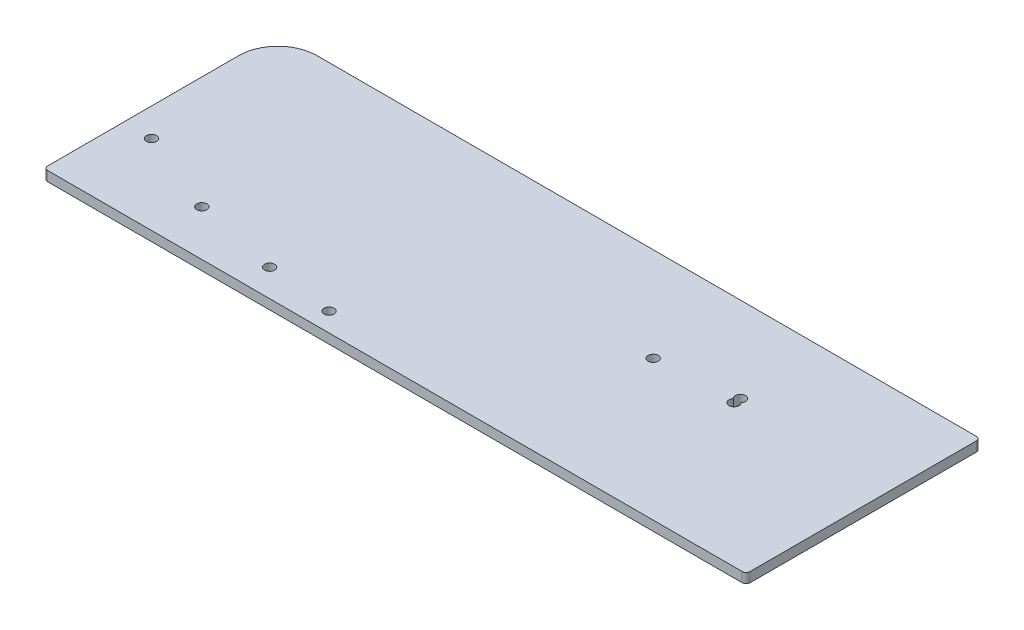
ISO-10303-21;
HEADER;
FILE_DESCRIPTION(('STEP AP214'),'2;1');
FILE_NAME('part.step','',(''),(''),'','','');
FILE_SCHEMA(('AUTOMOTIVE_DESIGN { 1 0 10303 214 1 1 1 1 }'));
ENDSEC;
DATA;
#1=APPLICATION_CONTEXT('core data for automotive mechanical design processes');
#2=APPLICATION_PROTOCOL_DEFINITION('international standard','automotive_design',2000,#1);
#3=PRODUCT_CONTEXT('',#1,'mechanical');
#4=PRODUCT('Part','Part','',(#3));
#5=PRODUCT_RELATED_PRODUCT_CATEGORY('part','',(#4));
#6=PRODUCT_DEFINITION_FORMATION('','',#4);
#7=PRODUCT_DEFINITION_CONTEXT('part definition',#1,'design');
#8=PRODUCT_DEFINITION('design','',#6,#7);
#9=PRODUCT_DEFINITION_SHAPE('','',#8);
#10=(LENGTH_UNIT() NAMED_UNIT(*) SI_UNIT(.MILLI.,.METRE.));
#11=(NAMED_UNIT(*) PLANE_ANGLE_UNIT() SI_UNIT($,.RADIAN.));
#12=(NAMED_UNIT(*) SI_UNIT($,.STERADIAN.) SOLID_ANGLE_UNIT());
#13=UNCERTAINTY_MEASURE_WITH_UNIT(LENGTH_MEASURE(1.E-05),#10,'distance_accuracy_value','');
#14=(GEOMETRIC_REPRESENTATION_CONTEXT(3) GLOBAL_UNCERTAINTY_ASSIGNED_CONTEXT((#13)) GLOBAL_UNIT_ASSIGNED_CONTEXT((#10,
#11,#12)) REPRESENTATION_CONTEXT('',''));
#15=CARTESIAN_POINT('',(0.,0.,0.));
#16=DIRECTION('',(0.,0.,1.));
#17=DIRECTION('',(1.,0.,0.));
#18=AXIS2_PLACEMENT_3D('',#15,#16,#17);
#19=CARTESIAN_POINT('',(13.97,666.75,-25.4));
#20=DIRECTION('',(1.,0.,0.));
#21=DIRECTION('',(0.,0.,-1.));
#22=AXIS2_PLACEMENT_3D('',#19,#20,#21);
#23=PLANE('',#22);
#24=DIRECTION('',(0.,0.,1.));
#25=VECTOR('',#24,1.);
#26=CARTESIAN_POINT('',(13.97,660.4,-25.4));
#27=LINE('',#26,#25);
#28=CARTESIAN_POINT('',(13.97,660.4,-152.4));
#29=VERTEX_POINT('',#28);
#30=CARTESIAN_POINT('',(13.97,660.4,-27.94));
#31=VERTEX_POINT('',#30);
#32=EDGE_CURVE('E167',#29,#31,#27,.T.);
#33=ORIENTED_EDGE('',*,*,#32,.T.);
#34=DIRECTION('',(0.,-1.,0.));
#35=VECTOR('',#34,1.);
#36=CARTESIAN_POINT('',(13.97,666.75,-27.94));
#37=LINE('',#36,#35);
#38=CARTESIAN_POINT('',(13.97,666.75,-27.94));
#39=VERTEX_POINT('',#38);
#40=EDGE_CURVE('E11',#31,#39,#37,.F.);
#41=ORIENTED_EDGE('',*,*,#40,.T.);
#42=DIRECTION('',(0.,0.,1.));
#43=VECTOR('',#42,1.);
#44=CARTESIAN_POINT('',(13.97,666.75,-25.4));
#45=LINE('',#44,#43);
#46=CARTESIAN_POINT('',(13.97,666.75,-152.4));
#47=VERTEX_POINT('',#46);
#48=EDGE_CURVE('E156',#47,#39,#45,.T.);
#49=ORIENTED_EDGE('',*,*,#48,.F.);
#50=DIRECTION('',(0.,-1.,0.));
#51=VECTOR('',#50,1.);
#52=CARTESIAN_POINT('',(13.97,666.75,-152.4));
#53=LINE('',#52,#51);
#54=EDGE_CURVE('E166',#47,#29,#53,.T.);
#55=ORIENTED_EDGE('',*,*,#54,.T.);
#56=EDGE_LOOP('',(#33,#41,#49,#55));
#57=FACE_BOUND('',#56,.T.);
#58=ADVANCED_FACE('F41',(#57),#23,.F.);
#59=CARTESIAN_POINT('',(13.97,666.75,-25.4));
#60=DIRECTION('',(0.,0.,-1.));
#61=DIRECTION('',(-1.,0.,0.));
#62=AXIS2_PLACEMENT_3D('',#59,#60,#61);
#63=PLANE('',#62);
#64=DIRECTION('',(1.,0.,0.));
#65=VECTOR('',#64,1.);
#66=CARTESIAN_POINT('',(13.97,660.4,-25.4));
#67=LINE('',#66,#65);
#68=CARTESIAN_POINT('',(16.51,660.4,-25.4));
#69=VERTEX_POINT('',#68);
#70=CARTESIAN_POINT('',(468.63,660.4,-25.4));
#71=VERTEX_POINT('',#70);
#72=EDGE_CURVE('E170',#69,#71,#67,.T.);
#73=ORIENTED_EDGE('',*,*,#72,.T.);
#74=DIRECTION('',(0.,-1.,0.));
#75=VECTOR('',#74,1.);
#76=CARTESIAN_POINT('',(468.63,666.75,-25.4));
#77=LINE('',#76,#75);
#78=CARTESIAN_POINT('',(468.63,666.75,-25.4));
#79=VERTEX_POINT('',#78);
#80=EDGE_CURVE('E49',#71,#79,#77,.F.);
#81=ORIENTED_EDGE('',*,*,#80,.T.);
#82=DIRECTION('',(1.,0.,0.));
#83=VECTOR('',#82,1.);
#84=CARTESIAN_POINT('',(13.97,666.75,-25.4));
#85=LINE('',#84,#83);
#86=CARTESIAN_POINT('',(16.51,666.75,-25.4));
#87=VERTEX_POINT('',#86);
#88=EDGE_CURVE('E158',#87,#79,#85,.T.);
#89=ORIENTED_EDGE('',*,*,#88,.F.);
#90=DIRECTION('',(0.,-1.,0.));
#91=VECTOR('',#90,1.);
#92=CARTESIAN_POINT('',(16.51,666.75,-25.4));
#93=LINE('',#92,#91);
#94=EDGE_CURVE('E222',#87,#69,#93,.T.);
#95=ORIENTED_EDGE('',*,*,#94,.T.);
#96=EDGE_LOOP('',(#73,#81,#89,#95));
#97=FACE_BOUND('',#96,.T.);
#98=ADVANCED_FACE('F226',(#97),#63,.F.);
#99=CARTESIAN_POINT('',(471.17,666.75,-25.4));
#100=DIRECTION('',(-1.,0.,0.));
#101=DIRECTION('',(0.,0.,1.));
#102=AXIS2_PLACEMENT_3D('',#99,#100,#101);
#103=PLANE('',#102);
#104=DIRECTION('',(0.,0.,-1.));
#105=VECTOR('',#104,1.);
#106=CARTESIAN_POINT('',(471.17,660.4,-25.4));
#107=LINE('',#106,#105);
#108=CARTESIAN_POINT('',(471.17,660.4,-27.94));
#109=VERTEX_POINT('',#108);
#110=CARTESIAN_POINT('',(471.17,660.4,-175.26));
#111=VERTEX_POINT('',#110);
#112=EDGE_CURVE('E173',#109,#111,#107,.T.);
#113=ORIENTED_EDGE('',*,*,#112,.T.);
#114=DIRECTION('',(0.,-1.,0.));
#115=VECTOR('',#114,1.);
#116=CARTESIAN_POINT('',(471.17,666.75,-175.26));
#117=LINE('',#116,#115);
#118=CARTESIAN_POINT('',(471.17,666.75,-175.26));
#119=VERTEX_POINT('',#118);
#120=EDGE_CURVE('E215',#111,#119,#117,.F.);
#121=ORIENTED_EDGE('',*,*,#120,.T.);
#122=DIRECTION('',(0.,0.,-1.));
#123=VECTOR('',#122,1.);
#124=CARTESIAN_POINT('',(471.17,666.75,-25.4));
#125=LINE('',#124,#123);
#126=CARTESIAN_POINT('',(471.17,666.75,-27.94));
#127=VERTEX_POINT('',#126);
#128=EDGE_CURVE('E161',#127,#119,#125,.T.);
#129=ORIENTED_EDGE('',*,*,#128,.F.);
#130=DIRECTION('',(0.,-1.,0.));
#131=VECTOR('',#130,1.);
#132=CARTESIAN_POINT('',(471.17,666.75,-27.94));
#133=LINE('',#132,#131);
#134=EDGE_CURVE('E212',#127,#109,#133,.T.);
#135=ORIENTED_EDGE('',*,*,#134,.T.);
#136=EDGE_LOOP('',(#113,#121,#129,#135));
#137=FACE_BOUND('',#136,.T.);
#138=ADVANCED_FACE('F239',(#137),#103,.F.);
#139=CARTESIAN_POINT('',(13.97,666.75,-177.8));
#140=DIRECTION('',(0.,0.,1.));
#141=DIRECTION('',(1.,0.,0.));
#142=AXIS2_PLACEMENT_3D('',#139,#140,#141);
#143=PLANE('',#142);
#144=DIRECTION('',(-1.,0.,0.));
#145=VECTOR('',#144,1.);
#146=CARTESIAN_POINT('',(13.97,666.75,-177.8));
#147=LINE('',#146,#145);
#148=CARTESIAN_POINT('',(468.63,666.75,-177.8));
#149=VERTEX_POINT('',#148);
#150=CARTESIAN_POINT('',(39.37,666.75,-177.8));
#151=VERTEX_POINT('',#150);
#152=EDGE_CURVE('E164',#149,#151,#147,.T.);
#153=ORIENTED_EDGE('',*,*,#152,.F.);
#154=DIRECTION('',(0.,-1.,0.));
#155=VECTOR('',#154,1.);
#156=CARTESIAN_POINT('',(468.63,666.75,-177.8));
#157=LINE('',#156,#155);
#158=CARTESIAN_POINT('',(468.63,660.4,-177.8));
#159=VERTEX_POINT('',#158);
#160=EDGE_CURVE('E203',#149,#159,#157,.T.);
#161=ORIENTED_EDGE('',*,*,#160,.T.);
#162=DIRECTION('',(-1.,0.,0.));
#163=VECTOR('',#162,1.);
#164=CARTESIAN_POINT('',(13.97,660.4,-177.8));
#165=LINE('',#164,#163);
#166=CARTESIAN_POINT('',(39.37,660.4,-177.8));
#167=VERTEX_POINT('',#166);
#168=EDGE_CURVE('E159',#159,#167,#165,.T.);
#169=ORIENTED_EDGE('',*,*,#168,.T.);
#170=DIRECTION('',(0.,-1.,0.));
#171=VECTOR('',#170,1.);
#172=CARTESIAN_POINT('',(39.37,666.75,-177.8));
#173=LINE('',#172,#171);
#174=EDGE_CURVE('E182',#167,#151,#173,.F.);
#175=ORIENTED_EDGE('',*,*,#174,.T.);
#176=EDGE_LOOP('',(#153,#161,#169,#175));
#177=FACE_BOUND('',#176,.T.);
#178=ADVANCED_FACE('F247',(#177),#143,.F.);
#179=CARTESIAN_POINT('',(0.,666.75,0.));
#180=DIRECTION('',(0.,-1.,0.));
#181=DIRECTION('',(0.,0.,-1.));
#182=AXIS2_PLACEMENT_3D('',#179,#180,#181);
#183=PLANE('',#182);
#184=CARTESIAN_POINT('',(370.500424304969,666.75,-122.370161165953));
#185=DIRECTION('',(0.,-1.,0.));
#186=DIRECTION('',(0.,0.,-1.));
#187=AXIS2_PLACEMENT_3D('',#184,#185,#186);
#188=CIRCLE('',#187,3.30200000000015);
#189=CARTESIAN_POINT('',(368.235920217802,666.75,-119.966991334417));
#190=VERTEX_POINT('',#189);
#191=CARTESIAN_POINT('',(373.075128259812,666.75,-120.30277065013));
#192=VERTEX_POINT('',#191);
#193=EDGE_CURVE('E129',#190,#192,#188,.T.);
#194=ORIENTED_EDGE('',*,*,#193,.T.);
#195=CARTESIAN_POINT('',(370.810624172645,666.75,-117.899600818595));
#196=DIRECTION('',(0.,-1.,0.));
#197=DIRECTION('',(0.,0.,-1.));
#198=AXIS2_PLACEMENT_3D('',#195,#196,#197);
#199=CIRCLE('',#198,3.30200000000015);
#200=EDGE_CURVE('E122',#192,#190,#199,.T.);
#201=ORIENTED_EDGE('',*,*,#200,.T.);
#202=EDGE_LOOP('',(#194,#201));
#203=FACE_BOUND('',#202,.T.);
#204=CARTESIAN_POINT('',(319.459191205803,666.75,-116.582508471068));
#205=DIRECTION('',(0.,-1.,0.));
#206=DIRECTION('',(0.,0.,-1.));
#207=AXIS2_PLACEMENT_3D('',#204,#205,#206);
#208=CIRCLE('',#207,3.3020000000001);
#209=CARTESIAN_POINT('',(319.459191205803,666.75,-119.884508471068));
#210=VERTEX_POINT('',#209);
#211=EDGE_CURVE('E137',#210,#210,#208,.T.);
#212=ORIENTED_EDGE('',*,*,#211,.T.);
#213=EDGE_LOOP('',(#212));
#214=FACE_BOUND('',#213,.T.);
#215=CARTESIAN_POINT('',(143.277879935957,666.75,-43.1319211358575));
#216=DIRECTION('',(0.,-1.,0.));
#217=DIRECTION('',(0.,0.,-1.));
#218=AXIS2_PLACEMENT_3D('',#215,#216,#217);
#219=CIRCLE('',#218,3.30200000000001);
#220=CARTESIAN_POINT('',(143.277879935957,666.75,-46.4339211358575));
#221=VERTEX_POINT('',#220);
#222=EDGE_CURVE('E140',#221,#221,#219,.T.);
#223=ORIENTED_EDGE('',*,*,#222,.T.);
#224=EDGE_LOOP('',(#223));
#225=FACE_BOUND('',#224,.T.);
#226=CARTESIAN_POINT('',(87.1729636341539,666.75,-55.1388885617992));
#227=DIRECTION('',(0.,-1.,0.));
#228=DIRECTION('',(0.,0.,-1.));
#229=AXIS2_PLACEMENT_3D('',#226,#227,#228);
#230=CIRCLE('',#229,3.30200000000003);
#231=CARTESIAN_POINT('',(87.1729636341539,666.75,-58.4408885617993));
#232=VERTEX_POINT('',#231);
#233=EDGE_CURVE('E147',#232,#232,#230,.T.);
#234=ORIENTED_EDGE('',*,*,#233,.T.);
#235=EDGE_LOOP('',(#234));
#236=FACE_BOUND('',#235,.T.);
#237=CARTESIAN_POINT('',(32.3062398613467,666.75,-77.2301248884168));
#238=DIRECTION('',(0.,-1.,0.));
#239=DIRECTION('',(0.,0.,-1.));
#240=AXIS2_PLACEMENT_3D('',#237,#238,#239);
#241=CIRCLE('',#240,3.302);
#242=CARTESIAN_POINT('',(32.3062398613467,666.75,-80.5321248884168));
#243=VERTEX_POINT('',#242);
#244=EDGE_CURVE('E150',#243,#243,#241,.T.);
#245=ORIENTED_EDGE('',*,*,#244,.T.);
#246=EDGE_LOOP('',(#245));
#247=FACE_BOUND('',#246,.T.);
#248=CARTESIAN_POINT('',(187.396556376414,666.75,-37.714828821499));
#249=DIRECTION('',(0.,-1.,0.));
#250=DIRECTION('',(0.,0.,-1.));
#251=AXIS2_PLACEMENT_3D('',#248,#249,#250);
#252=CIRCLE('',#251,3.30199999999995);
#253=CARTESIAN_POINT('',(187.396556376414,666.75,-41.0168288214989));
#254=VERTEX_POINT('',#253);
#255=EDGE_CURVE('E153',#254,#254,#252,.T.);
#256=ORIENTED_EDGE('',*,*,#255,.T.);
#257=EDGE_LOOP('',(#256));
#258=FACE_BOUND('',#257,.T.);
#259=ORIENTED_EDGE('',*,*,#128,.T.);
#260=CARTESIAN_POINT('',(468.63,666.75,-175.26));
#261=DIRECTION('',(0.,-1.,0.));
#262=DIRECTION('',(0.,0.,-1.));
#263=AXIS2_PLACEMENT_3D('',#260,#261,#262);
#264=CIRCLE('',#263,2.54);
#265=EDGE_CURVE('E220',#119,#149,#264,.F.);
#266=ORIENTED_EDGE('',*,*,#265,.T.);
#267=ORIENTED_EDGE('',*,*,#152,.T.);
#268=CARTESIAN_POINT('',(39.37,666.75,-152.4));
#269=DIRECTION('',(0.,-1.,0.));
#270=DIRECTION('',(0.,0.,-1.));
#271=AXIS2_PLACEMENT_3D('',#268,#269,#270);
#272=CIRCLE('',#271,25.4);
#273=EDGE_CURVE('E185',#151,#47,#272,.F.);
#274=ORIENTED_EDGE('',*,*,#273,.T.);
#275=ORIENTED_EDGE('',*,*,#48,.T.);
#276=CARTESIAN_POINT('',(16.51,666.75,-27.94));
#277=DIRECTION('',(0.,-1.,0.));
#278=DIRECTION('',(0.,0.,-1.));
#279=AXIS2_PLACEMENT_3D('',#276,#277,#278);
#280=CIRCLE('',#279,2.54);
#281=EDGE_CURVE('E62',#39,#87,#280,.F.);
#282=ORIENTED_EDGE('',*,*,#281,.T.);
#283=ORIENTED_EDGE('',*,*,#88,.T.);
#284=CARTESIAN_POINT('',(468.63,666.75,-27.94));
#285=DIRECTION('',(0.,-1.,0.));
#286=DIRECTION('',(0.,0.,-1.));
#287=AXIS2_PLACEMENT_3D('',#284,#285,#286);
#288=CIRCLE('',#287,2.54);
#289=EDGE_CURVE('E218',#79,#127,#288,.F.);
#290=ORIENTED_EDGE('',*,*,#289,.T.);
#291=EDGE_LOOP('',(#259,#266,#267,#274,#275,#282,#283,#290));
#292=FACE_BOUND('',#291,.T.);
#293=ADVANCED_FACE('F135',(#203,#214,#225,#236,#247,#258,#292),#183,.F.);
#294=CARTESIAN_POINT('',(0.,660.4,0.));
#295=DIRECTION('',(0.,-1.,0.));
#296=DIRECTION('',(0.,0.,-1.));
#297=AXIS2_PLACEMENT_3D('',#294,#295,#296);
#298=PLANE('',#297);
#299=CARTESIAN_POINT('',(370.810624172645,660.4,-117.899600818595));
#300=DIRECTION('',(0.,-1.,0.));
#301=DIRECTION('',(0.,0.,-1.));
#302=AXIS2_PLACEMENT_3D('',#299,#300,#301);
#303=CIRCLE('',#302,3.30200000000015);
#304=CARTESIAN_POINT('',(373.075128259812,660.4,-120.30277065013));
#305=VERTEX_POINT('',#304);
#306=CARTESIAN_POINT('',(368.235920217802,660.4,-119.966991334417));
#307=VERTEX_POINT('',#306);
#308=EDGE_CURVE('E125',#305,#307,#303,.T.);
#309=ORIENTED_EDGE('',*,*,#308,.F.);
#310=CARTESIAN_POINT('',(370.500424304969,660.4,-122.370161165953));
#311=DIRECTION('',(0.,-1.,0.));
#312=DIRECTION('',(0.,0.,-1.));
#313=AXIS2_PLACEMENT_3D('',#310,#311,#312);
#314=CIRCLE('',#313,3.30200000000015);
#315=EDGE_CURVE('E187',#307,#305,#314,.T.);
#316=ORIENTED_EDGE('',*,*,#315,.F.);
#317=EDGE_LOOP('',(#309,#316));
#318=FACE_BOUND('',#317,.T.);
#319=CARTESIAN_POINT('',(319.459191205803,660.4,-116.582508471068));
#320=DIRECTION('',(0.,-1.,0.));
#321=DIRECTION('',(0.,0.,-1.));
#322=AXIS2_PLACEMENT_3D('',#319,#320,#321);
#323=CIRCLE('',#322,3.3020000000001);
#324=CARTESIAN_POINT('',(319.459191205803,660.4,-119.884508471068));
#325=VERTEX_POINT('',#324);
#326=EDGE_CURVE('E171',#325,#325,#323,.T.);
#327=ORIENTED_EDGE('',*,*,#326,.F.);
#328=EDGE_LOOP('',(#327));
#329=FACE_BOUND('',#328,.T.);
#330=CARTESIAN_POINT('',(143.277879935957,660.4,-43.1319211358575));
#331=DIRECTION('',(0.,-1.,0.));
#332=DIRECTION('',(0.,0.,-1.));
#333=AXIS2_PLACEMENT_3D('',#330,#331,#332);
#334=CIRCLE('',#333,3.30200000000001);
#335=CARTESIAN_POINT('',(143.277879935957,660.4,-46.4339211358575));
#336=VERTEX_POINT('',#335);
#337=EDGE_CURVE('E196',#336,#336,#334,.T.);
#338=ORIENTED_EDGE('',*,*,#337,.F.);
#339=EDGE_LOOP('',(#338));
#340=FACE_BOUND('',#339,.T.);
#341=CARTESIAN_POINT('',(87.1729636341539,660.4,-55.1388885617992));
#342=DIRECTION('',(0.,-1.,0.));
#343=DIRECTION('',(0.,0.,-1.));
#344=AXIS2_PLACEMENT_3D('',#341,#342,#343);
#345=CIRCLE('',#344,3.30200000000003);
#346=CARTESIAN_POINT('',(87.1729636341539,660.4,-58.4408885617993));
#347=VERTEX_POINT('',#346);
#348=EDGE_CURVE('E193',#347,#347,#345,.T.);
#349=ORIENTED_EDGE('',*,*,#348,.F.);
#350=EDGE_LOOP('',(#349));
#351=FACE_BOUND('',#350,.T.);
#352=CARTESIAN_POINT('',(32.3062398613467,660.4,-77.2301248884168));
#353=DIRECTION('',(0.,-1.,0.));
#354=DIRECTION('',(0.,0.,-1.));
#355=AXIS2_PLACEMENT_3D('',#352,#353,#354);
#356=CIRCLE('',#355,3.302);
#357=CARTESIAN_POINT('',(32.3062398613467,660.4,-80.5321248884168));
#358=VERTEX_POINT('',#357);
#359=EDGE_CURVE('E190',#358,#358,#356,.T.);
#360=ORIENTED_EDGE('',*,*,#359,.F.);
#361=EDGE_LOOP('',(#360));
#362=FACE_BOUND('',#361,.T.);
#363=CARTESIAN_POINT('',(187.396556376414,660.4,-37.714828821499));
#364=DIRECTION('',(0.,-1.,0.));
#365=DIRECTION('',(0.,0.,-1.));
#366=AXIS2_PLACEMENT_3D('',#363,#364,#365);
#367=CIRCLE('',#366,3.30199999999995);
#368=CARTESIAN_POINT('',(187.396556376414,660.4,-41.0168288214989));
#369=VERTEX_POINT('',#368);
#370=EDGE_CURVE('E143',#369,#369,#367,.T.);
#371=ORIENTED_EDGE('',*,*,#370,.F.);
#372=EDGE_LOOP('',(#371));
#373=FACE_BOUND('',#372,.T.);
#374=ORIENTED_EDGE('',*,*,#168,.F.);
#375=CARTESIAN_POINT('',(468.63,660.4,-175.26));
#376=DIRECTION('',(0.,-1.,0.));
#377=DIRECTION('',(0.,0.,-1.));
#378=AXIS2_PLACEMENT_3D('',#375,#376,#377);
#379=CIRCLE('',#378,2.54);
#380=EDGE_CURVE('E210',#159,#111,#379,.T.);
#381=ORIENTED_EDGE('',*,*,#380,.T.);
#382=ORIENTED_EDGE('',*,*,#112,.F.);
#383=CARTESIAN_POINT('',(468.63,660.4,-27.94));
#384=DIRECTION('',(0.,-1.,0.));
#385=DIRECTION('',(0.,0.,-1.));
#386=AXIS2_PLACEMENT_3D('',#383,#384,#385);
#387=CIRCLE('',#386,2.54);
#388=EDGE_CURVE('E208',#109,#71,#387,.T.);
#389=ORIENTED_EDGE('',*,*,#388,.T.);
#390=ORIENTED_EDGE('',*,*,#72,.F.);
#391=CARTESIAN_POINT('',(16.51,660.4,-27.94));
#392=DIRECTION('',(0.,-1.,0.));
#393=DIRECTION('',(0.,0.,-1.));
#394=AXIS2_PLACEMENT_3D('',#391,#392,#393);
#395=CIRCLE('',#394,2.54);
#396=EDGE_CURVE('E206',#69,#31,#395,.T.);
#397=ORIENTED_EDGE('',*,*,#396,.T.);
#398=ORIENTED_EDGE('',*,*,#32,.F.);
#399=CARTESIAN_POINT('',(39.37,660.4,-152.4));
#400=DIRECTION('',(0.,-1.,0.));
#401=DIRECTION('',(0.,0.,-1.));
#402=AXIS2_PLACEMENT_3D('',#399,#400,#401);
#403=CIRCLE('',#402,25.4);
#404=EDGE_CURVE('E179',#29,#167,#403,.T.);
#405=ORIENTED_EDGE('',*,*,#404,.T.);
#406=EDGE_LOOP('',(#374,#381,#382,#389,#390,#397,#398,#405));
#407=FACE_BOUND('',#406,.T.);
#408=ADVANCED_FACE('F230',(#318,#329,#340,#351,#362,#373,#407),#298,.T.);
#409=CARTESIAN_POINT('',(39.37,666.75,-152.4));
#410=DIRECTION('',(0.,-1.,0.));
#411=DIRECTION('',(0.,0.,-1.));
#412=AXIS2_PLACEMENT_3D('',#409,#410,#411);
#413=CYLINDRICAL_SURFACE('',#412,25.4);
#414=ORIENTED_EDGE('',*,*,#273,.F.);
#415=ORIENTED_EDGE('',*,*,#174,.F.);
#416=ORIENTED_EDGE('',*,*,#404,.F.);
#417=ORIENTED_EDGE('',*,*,#54,.F.);
#418=EDGE_LOOP('',(#414,#415,#416,#417));
#419=FACE_BOUND('',#418,.T.);
#420=ADVANCED_FACE('F252',(#419),#413,.T.);
#421=CARTESIAN_POINT('',(187.396556376414,666.75,-37.714828821499));
#422=DIRECTION('',(0.,-1.,0.));
#423=DIRECTION('',(0.,0.,-1.));
#424=AXIS2_PLACEMENT_3D('',#421,#422,#423);
#425=CYLINDRICAL_SURFACE('',#424,3.30199999999995);
#426=ORIENTED_EDGE('',*,*,#370,.T.);
#427=EDGE_LOOP('',(#426));
#428=FACE_BOUND('',#427,.T.);
#429=ORIENTED_EDGE('',*,*,#255,.F.);
#430=EDGE_LOOP('',(#429));
#431=FACE_BOUND('',#430,.T.);
#432=ADVANCED_FACE('F271',(#428,#431),#425,.F.);
#433=CARTESIAN_POINT('',(32.3062398613467,666.75,-77.2301248884168));
#434=DIRECTION('',(0.,-1.,0.));
#435=DIRECTION('',(0.,0.,-1.));
#436=AXIS2_PLACEMENT_3D('',#433,#434,#435);
#437=CYLINDRICAL_SURFACE('',#436,3.302);
#438=ORIENTED_EDGE('',*,*,#359,.T.);
#439=EDGE_LOOP('',(#438));
#440=FACE_BOUND('',#439,.T.);
#441=ORIENTED_EDGE('',*,*,#244,.F.);
#442=EDGE_LOOP('',(#441));
#443=FACE_BOUND('',#442,.T.);
#444=ADVANCED_FACE('F295',(#440,#443),#437,.F.);
#445=CARTESIAN_POINT('',(87.1729636341539,666.75,-55.1388885617992));
#446=DIRECTION('',(0.,-1.,0.));
#447=DIRECTION('',(0.,0.,-1.));
#448=AXIS2_PLACEMENT_3D('',#445,#446,#447);
#449=CYLINDRICAL_SURFACE('',#448,3.30200000000003);
#450=ORIENTED_EDGE('',*,*,#348,.T.);
#451=EDGE_LOOP('',(#450));
#452=FACE_BOUND('',#451,.T.);
#453=ORIENTED_EDGE('',*,*,#233,.F.);
#454=EDGE_LOOP('',(#453));
#455=FACE_BOUND('',#454,.T.);
#456=ADVANCED_FACE('F291',(#452,#455),#449,.F.);
#457=CARTESIAN_POINT('',(143.277879935957,666.75,-43.1319211358575));
#458=DIRECTION('',(0.,-1.,0.));
#459=DIRECTION('',(0.,0.,-1.));
#460=AXIS2_PLACEMENT_3D('',#457,#458,#459);
#461=CYLINDRICAL_SURFACE('',#460,3.30200000000001);
#462=ORIENTED_EDGE('',*,*,#337,.T.);
#463=EDGE_LOOP('',(#462));
#464=FACE_BOUND('',#463,.T.);
#465=ORIENTED_EDGE('',*,*,#222,.F.);
#466=EDGE_LOOP('',(#465));
#467=FACE_BOUND('',#466,.T.);
#468=ADVANCED_FACE('F287',(#464,#467),#461,.F.);
#469=CARTESIAN_POINT('',(319.459191205803,666.75,-116.582508471068));
#470=DIRECTION('',(0.,-1.,0.));
#471=DIRECTION('',(0.,0.,-1.));
#472=AXIS2_PLACEMENT_3D('',#469,#470,#471);
#473=CYLINDRICAL_SURFACE('',#472,3.3020000000001);
#474=ORIENTED_EDGE('',*,*,#326,.T.);
#475=EDGE_LOOP('',(#474));
#476=FACE_BOUND('',#475,.T.);
#477=ORIENTED_EDGE('',*,*,#211,.F.);
#478=EDGE_LOOP('',(#477));
#479=FACE_BOUND('',#478,.T.);
#480=ADVANCED_FACE('F282',(#476,#479),#473,.F.);
#481=CARTESIAN_POINT('',(370.810624172645,666.75,-117.899600818595));
#482=DIRECTION('',(0.,-1.,0.));
#483=DIRECTION('',(0.,0.,-1.));
#484=AXIS2_PLACEMENT_3D('',#481,#482,#483);
#485=CYLINDRICAL_SURFACE('',#484,3.30200000000015);
#486=ORIENTED_EDGE('',*,*,#308,.T.);
#487=DIRECTION('',(0.,-1.,0.));
#488=VECTOR('',#487,1.);
#489=CARTESIAN_POINT('',(368.235920217802,666.75,-119.966991334417));
#490=LINE('',#489,#488);
#491=EDGE_CURVE('E117',#190,#307,#490,.T.);
#492=ORIENTED_EDGE('',*,*,#491,.F.);
#493=ORIENTED_EDGE('',*,*,#200,.F.);
#494=DIRECTION('',(0.,-1.,0.));
#495=VECTOR('',#494,1.);
#496=CARTESIAN_POINT('',(373.075128259812,666.75,-120.30277065013));
#497=LINE('',#496,#495);
#498=EDGE_CURVE('E128',#192,#305,#497,.T.);
#499=ORIENTED_EDGE('',*,*,#498,.T.);
#500=EDGE_LOOP('',(#486,#492,#493,#499));
#501=FACE_BOUND('',#500,.T.);
#502=ADVANCED_FACE('F119',(#501),#485,.F.);
#503=CARTESIAN_POINT('',(370.500424304969,666.75,-122.370161165953));
#504=DIRECTION('',(0.,-1.,0.));
#505=DIRECTION('',(0.,0.,-1.));
#506=AXIS2_PLACEMENT_3D('',#503,#504,#505);
#507=CYLINDRICAL_SURFACE('',#506,3.30200000000015);
#508=ORIENTED_EDGE('',*,*,#315,.T.);
#509=ORIENTED_EDGE('',*,*,#498,.F.);
#510=ORIENTED_EDGE('',*,*,#193,.F.);
#511=ORIENTED_EDGE('',*,*,#491,.T.);
#512=EDGE_LOOP('',(#508,#509,#510,#511));
#513=FACE_BOUND('',#512,.T.);
#514=ADVANCED_FACE('F132',(#513),#507,.F.);
#515=CARTESIAN_POINT('',(468.63,666.75,-175.26));
#516=DIRECTION('',(0.,-1.,0.));
#517=DIRECTION('',(0.,0.,-1.));
#518=AXIS2_PLACEMENT_3D('',#515,#516,#517);
#519=CYLINDRICAL_SURFACE('',#518,2.54);
#520=ORIENTED_EDGE('',*,*,#265,.F.);
#521=ORIENTED_EDGE('',*,*,#120,.F.);
#522=ORIENTED_EDGE('',*,*,#380,.F.);
#523=ORIENTED_EDGE('',*,*,#160,.F.);
#524=EDGE_LOOP('',(#520,#521,#522,#523));
#525=FACE_BOUND('',#524,.T.);
#526=ADVANCED_FACE('F245',(#525),#519,.T.);
#527=CARTESIAN_POINT('',(468.63,666.75,-27.94));
#528=DIRECTION('',(0.,-1.,0.));
#529=DIRECTION('',(0.,0.,-1.));
#530=AXIS2_PLACEMENT_3D('',#527,#528,#529);
#531=CYLINDRICAL_SURFACE('',#530,2.54);
#532=ORIENTED_EDGE('',*,*,#289,.F.);
#533=ORIENTED_EDGE('',*,*,#80,.F.);
#534=ORIENTED_EDGE('',*,*,#388,.F.);
#535=ORIENTED_EDGE('',*,*,#134,.F.);
#536=EDGE_LOOP('',(#532,#533,#534,#535));
#537=FACE_BOUND('',#536,.T.);
#538=ADVANCED_FACE('F236',(#537),#531,.T.);
#539=CARTESIAN_POINT('',(16.51,666.75,-27.94));
#540=DIRECTION('',(0.,-1.,0.));
#541=DIRECTION('',(0.,0.,-1.));
#542=AXIS2_PLACEMENT_3D('',#539,#540,#541);
#543=CYLINDRICAL_SURFACE('',#542,2.54);
#544=ORIENTED_EDGE('',*,*,#281,.F.);
#545=ORIENTED_EDGE('',*,*,#40,.F.);
#546=ORIENTED_EDGE('',*,*,#396,.F.);
#547=ORIENTED_EDGE('',*,*,#94,.F.);
#548=EDGE_LOOP('',(#544,#545,#546,#547));
#549=FACE_BOUND('',#548,.T.);
#550=ADVANCED_FACE('F43',(#549),#543,.T.);
#551=CLOSED_SHELL('',(#58,#98,#138,#178,#293,#408,#420,#432,#444,#456,#468,#480,#502,#514,#526,
#538,#550));
#552=MANIFOLD_SOLID_BREP('B2',#551);
#553=ADVANCED_BREP_SHAPE_REPRESENTATION('',(#18,#552),#14);
#554=SHAPE_DEFINITION_REPRESENTATION(#9,#553);
ENDSEC;
END-ISO-10303-21;
